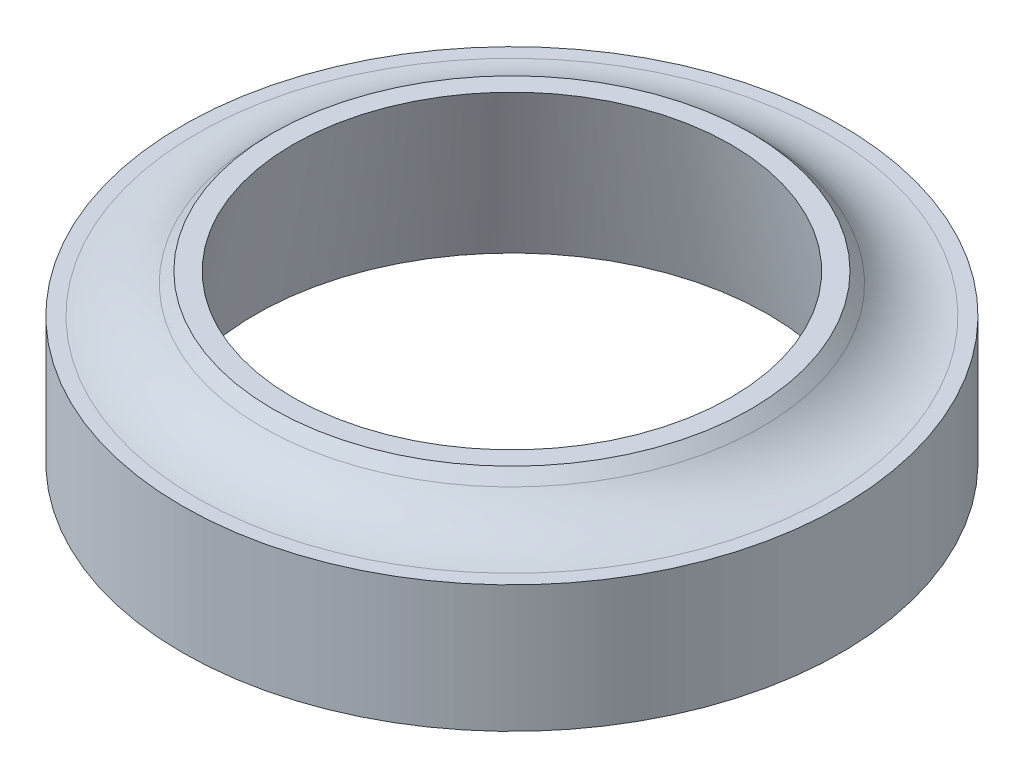
ISO-10303-21;
HEADER;
FILE_DESCRIPTION(('STEP AP214'),'2;1');
FILE_NAME('part.step','',(''),(''),'','','');
FILE_SCHEMA(('AUTOMOTIVE_DESIGN { 1 0 10303 214 1 1 1 1 }'));
ENDSEC;
DATA;
#1=APPLICATION_CONTEXT('core data for automotive mechanical design processes');
#2=APPLICATION_PROTOCOL_DEFINITION('international standard','automotive_design',2000,#1);
#3=PRODUCT_CONTEXT('',#1,'mechanical');
#4=PRODUCT('Part','Part','',(#3));
#5=PRODUCT_RELATED_PRODUCT_CATEGORY('part','',(#4));
#6=PRODUCT_DEFINITION_FORMATION('','',#4);
#7=PRODUCT_DEFINITION_CONTEXT('part definition',#1,'design');
#8=PRODUCT_DEFINITION('design','',#6,#7);
#9=PRODUCT_DEFINITION_SHAPE('','',#8);
#10=(LENGTH_UNIT() NAMED_UNIT(*) SI_UNIT(.MILLI.,.METRE.));
#11=(NAMED_UNIT(*) PLANE_ANGLE_UNIT() SI_UNIT($,.RADIAN.));
#12=(NAMED_UNIT(*) SI_UNIT($,.STERADIAN.) SOLID_ANGLE_UNIT());
#13=UNCERTAINTY_MEASURE_WITH_UNIT(LENGTH_MEASURE(1.E-05),#10,'distance_accuracy_value','');
#14=(GEOMETRIC_REPRESENTATION_CONTEXT(3) GLOBAL_UNCERTAINTY_ASSIGNED_CONTEXT((#13)) GLOBAL_UNIT_ASSIGNED_CONTEXT((#10,
#11,#12)) REPRESENTATION_CONTEXT('',''));
#15=CARTESIAN_POINT('',(0.,0.,0.));
#16=DIRECTION('',(0.,0.,1.));
#17=DIRECTION('',(1.,0.,0.));
#18=AXIS2_PLACEMENT_3D('',#15,#16,#17);
#19=CARTESIAN_POINT('',(-9.,0.0148895163314539,0.));
#20=DIRECTION('',(0.,-1.,0.));
#21=DIRECTION('',(0.,0.,-1.));
#22=AXIS2_PLACEMENT_3D('',#19,#20,#21);
#23=PLANE('',#22);
#24=CARTESIAN_POINT('',(0.,0.0148895163313983,0.));
#25=DIRECTION('',(0.,1.,0.));
#26=DIRECTION('',(0.,0.,1.));
#27=AXIS2_PLACEMENT_3D('',#24,#25,#26);
#28=CIRCLE('',#27,7.);
#29=CARTESIAN_POINT('',(0.,0.0148895163313983,7.));
#30=VERTEX_POINT('',#29);
#31=EDGE_CURVE('E69',#30,#30,#28,.T.);
#32=ORIENTED_EDGE('',*,*,#31,.T.);
#33=EDGE_LOOP('',(#32));
#34=FACE_BOUND('',#33,.T.);
#35=CARTESIAN_POINT('',(0.,0.0148895163315094,0.));
#36=DIRECTION('',(0.,1.,0.));
#37=DIRECTION('',(0.,0.,1.));
#38=AXIS2_PLACEMENT_3D('',#35,#36,#37);
#39=CIRCLE('',#38,9.);
#40=CARTESIAN_POINT('',(0.,0.0148895163315094,9.));
#41=VERTEX_POINT('',#40);
#42=EDGE_CURVE('E54',#41,#41,#39,.T.);
#43=ORIENTED_EDGE('',*,*,#42,.F.);
#44=EDGE_LOOP('',(#43));
#45=FACE_BOUND('',#44,.T.);
#46=ADVANCED_FACE('F43',(#34,#45),#23,.T.);
#47=CARTESIAN_POINT('',(0.,13.0590592778248,0.));
#48=DIRECTION('',(0.,1.,0.));
#49=DIRECTION('',(0.,0.,1.));
#50=AXIS2_PLACEMENT_3D('',#47,#48,#49);
#51=CYLINDRICAL_SURFACE('',#50,9.);
#52=ORIENTED_EDGE('',*,*,#42,.T.);
#53=EDGE_LOOP('',(#52));
#54=FACE_BOUND('',#53,.T.);
#55=CARTESIAN_POINT('',(0.,3.47979021093171,0.));
#56=DIRECTION('',(0.,1.,0.));
#57=DIRECTION('',(0.,0.,1.));
#58=AXIS2_PLACEMENT_3D('',#55,#56,#57);
#59=CIRCLE('',#58,9.);
#60=CARTESIAN_POINT('',(0.,3.47979021093171,9.));
#61=VERTEX_POINT('',#60);
#62=EDGE_CURVE('E58',#61,#61,#59,.T.);
#63=ORIENTED_EDGE('',*,*,#62,.F.);
#64=EDGE_LOOP('',(#63));
#65=FACE_BOUND('',#64,.T.);
#66=ADVANCED_FACE('F89',(#54,#65),#51,.T.);
#67=CARTESIAN_POINT('',(-7.54800741675771,3.47979021093171,0.));
#68=DIRECTION('',(0.,1.,0.));
#69=DIRECTION('',(0.,0.,1.));
#70=AXIS2_PLACEMENT_3D('',#67,#68,#69);
#71=PLANE('',#70);
#72=CARTESIAN_POINT('',(0.,3.47979021093171,0.));
#73=DIRECTION('',(0.,1.,0.));
#74=DIRECTION('',(0.,0.,1.));
#75=AXIS2_PLACEMENT_3D('',#72,#73,#74);
#76=CIRCLE('',#75,8.61189767878826);
#77=CARTESIAN_POINT('',(0.,3.47979021093171,8.61189767878826));
#78=VERTEX_POINT('',#77);
#79=EDGE_CURVE('E10',#78,#78,#76,.F.);
#80=ORIENTED_EDGE('',*,*,#79,.T.);
#81=EDGE_LOOP('',(#80));
#82=FACE_BOUND('',#81,.T.);
#83=ORIENTED_EDGE('',*,*,#62,.T.);
#84=EDGE_LOOP('',(#83));
#85=FACE_BOUND('',#84,.T.);
#86=ADVANCED_FACE('F93',(#82,#85),#71,.T.);
#87=CARTESIAN_POINT('',(0.,4.53902785546212,0.));
#88=DIRECTION('',(0.,-1.,0.));
#89=DIRECTION('',(0.,0.,-1.));
#90=AXIS2_PLACEMENT_3D('',#87,#88,#89);
#91=CONICAL_SURFACE('',#90,6.5288564546076,0.766113168970165);
#92=CARTESIAN_POINT('',(0.,4.24644123649023,0.));
#93=DIRECTION('',(0.,-1.,0.));
#94=DIRECTION('',(0.,0.,-1.));
#95=AXIS2_PLACEMENT_3D('',#92,#93,#94);
#96=CIRCLE('',#95,6.81037017891415);
#97=CARTESIAN_POINT('',(0.,4.24644123649023,-6.81037017891415));
#98=VERTEX_POINT('',#97);
#99=EDGE_CURVE('E50',#98,#98,#96,.F.);
#100=ORIENTED_EDGE('',*,*,#99,.T.);
#101=EDGE_LOOP('',(#100));
#102=FACE_BOUND('',#101,.T.);
#103=CARTESIAN_POINT('',(0.,4.53902785546212,0.));
#104=DIRECTION('',(0.,1.,0.));
#105=DIRECTION('',(0.,0.,1.));
#106=AXIS2_PLACEMENT_3D('',#103,#104,#105);
#107=CIRCLE('',#106,6.5288564546076);
#108=CARTESIAN_POINT('',(0.,4.53902785546212,6.5288564546076));
#109=VERTEX_POINT('',#108);
#110=EDGE_CURVE('E63',#109,#109,#107,.T.);
#111=ORIENTED_EDGE('',*,*,#110,.F.);
#112=EDGE_LOOP('',(#111));
#113=FACE_BOUND('',#112,.T.);
#114=ADVANCED_FACE('F85',(#102,#113),#91,.T.);
#115=CARTESIAN_POINT('',(-5.98143128020512,4.53902785546212,0.));
#116=DIRECTION('',(0.,1.,0.));
#117=DIRECTION('',(0.,0.,1.));
#118=AXIS2_PLACEMENT_3D('',#115,#116,#117);
#119=PLANE('',#118);
#120=ORIENTED_EDGE('',*,*,#110,.T.);
#121=EDGE_LOOP('',(#120));
#122=FACE_BOUND('',#121,.T.);
#123=CARTESIAN_POINT('',(0.,4.53902785546212,0.));
#124=DIRECTION('',(0.,1.,0.));
#125=DIRECTION('',(0.,0.,1.));
#126=AXIS2_PLACEMENT_3D('',#123,#124,#125);
#127=CIRCLE('',#126,5.98143128020512);
#128=CARTESIAN_POINT('',(0.,4.53902785546212,5.98143128020512));
#129=VERTEX_POINT('',#128);
#130=EDGE_CURVE('E66',#129,#129,#127,.T.);
#131=ORIENTED_EDGE('',*,*,#130,.F.);
#132=EDGE_LOOP('',(#131));
#133=FACE_BOUND('',#132,.T.);
#134=ADVANCED_FACE('F77',(#122,#133),#119,.T.);
#135=CARTESIAN_POINT('',(0.,0.0148895163313983,0.));
#136=DIRECTION('',(0.,-1.,0.));
#137=DIRECTION('',(0.,0.,-1.));
#138=AXIS2_PLACEMENT_3D('',#135,#136,#137);
#139=CONICAL_SURFACE('',#138,7.,0.221448578905566);
#140=ORIENTED_EDGE('',*,*,#130,.T.);
#141=EDGE_LOOP('',(#140));
#142=FACE_BOUND('',#141,.T.);
#143=ORIENTED_EDGE('',*,*,#31,.F.);
#144=EDGE_LOOP('',(#143));
#145=FACE_BOUND('',#144,.T.);
#146=ADVANCED_FACE('F75',(#142,#145),#139,.F.);
#147=CARTESIAN_POINT('',(0.,5.97979021093171,0.));
#148=DIRECTION('',(0.,1.,0.));
#149=DIRECTION('',(0.,0.,1.));
#150=AXIS2_PLACEMENT_3D('',#147,#148,#149);
#151=TOROIDAL_SURFACE('',#150,8.61189767878826,2.5);
#152=ORIENTED_EDGE('',*,*,#79,.F.);
#153=EDGE_LOOP('',(#152));
#154=FACE_BOUND('',#153,.T.);
#155=ORIENTED_EDGE('',*,*,#99,.F.);
#156=EDGE_LOOP('',(#155));
#157=FACE_BOUND('',#156,.T.);
#158=ADVANCED_FACE('F45',(#154,#157),#151,.F.);
#159=CLOSED_SHELL('',(#46,#66,#86,#114,#134,#146,#158));
#160=MANIFOLD_SOLID_BREP('B2',#159);
#161=ADVANCED_BREP_SHAPE_REPRESENTATION('',(#18,#160),#14);
#162=SHAPE_DEFINITION_REPRESENTATION(#9,#161);
ENDSEC;
END-ISO-10303-21;
